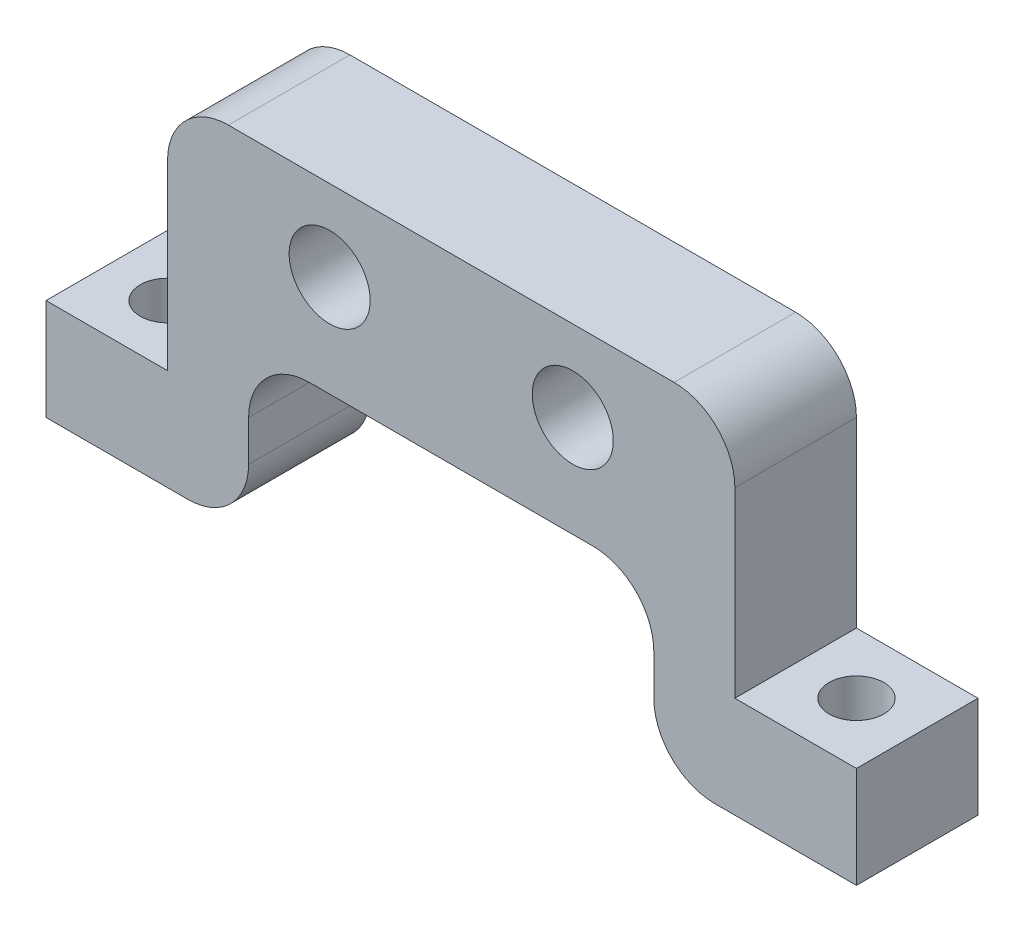
ISO-10303-21;
HEADER;
FILE_DESCRIPTION(('STEP AP214'),'2;1');
FILE_NAME('part.step','',(''),(''),'','','');
FILE_SCHEMA(('AUTOMOTIVE_DESIGN { 1 0 10303 214 1 1 1 1 }'));
ENDSEC;
DATA;
#1=APPLICATION_CONTEXT('core data for automotive mechanical design processes');
#2=APPLICATION_PROTOCOL_DEFINITION('international standard','automotive_design',2000,#1);
#3=PRODUCT_CONTEXT('',#1,'mechanical');
#4=PRODUCT('Part','Part','',(#3));
#5=PRODUCT_RELATED_PRODUCT_CATEGORY('part','',(#4));
#6=PRODUCT_DEFINITION_FORMATION('','',#4);
#7=PRODUCT_DEFINITION_CONTEXT('part definition',#1,'design');
#8=PRODUCT_DEFINITION('design','',#6,#7);
#9=PRODUCT_DEFINITION_SHAPE('','',#8);
#10=(LENGTH_UNIT() NAMED_UNIT(*) SI_UNIT(.MILLI.,.METRE.));
#11=(NAMED_UNIT(*) PLANE_ANGLE_UNIT() SI_UNIT($,.RADIAN.));
#12=(NAMED_UNIT(*) SI_UNIT($,.STERADIAN.) SOLID_ANGLE_UNIT());
#13=UNCERTAINTY_MEASURE_WITH_UNIT(LENGTH_MEASURE(1.E-05),#10,'distance_accuracy_value','');
#14=(GEOMETRIC_REPRESENTATION_CONTEXT(3) GLOBAL_UNCERTAINTY_ASSIGNED_CONTEXT((#13)) GLOBAL_UNIT_ASSIGNED_CONTEXT((#10,
#11,#12)) REPRESENTATION_CONTEXT('',''));
#15=CARTESIAN_POINT('',(0.,0.,0.));
#16=DIRECTION('',(0.,0.,1.));
#17=DIRECTION('',(1.,0.,0.));
#18=AXIS2_PLACEMENT_3D('',#15,#16,#17);
#19=CARTESIAN_POINT('',(-9.,-8.5,6.));
#20=DIRECTION('',(0.,1.,0.));
#21=DIRECTION('',(0.,0.,1.));
#22=AXIS2_PLACEMENT_3D('',#19,#20,#21);
#23=PLANE('',#22);
#24=CARTESIAN_POINT('',(-17.,-8.49999999999999,3.00000000000001));
#25=DIRECTION('',(0.,1.,0.));
#26=DIRECTION('',(1.,0.,0.));
#27=AXIS2_PLACEMENT_3D('',#24,#25,#26);
#28=CIRCLE('',#27,1.35);
#29=CARTESIAN_POINT('',(-15.65,-8.49999999999999,3.00000000000001));
#30=VERTEX_POINT('',#29);
#31=EDGE_CURVE('E379',#30,#30,#28,.T.);
#32=ORIENTED_EDGE('',*,*,#31,.T.);
#33=EDGE_LOOP('',(#32));
#34=FACE_BOUND('',#33,.T.);
#35=DIRECTION('',(1.,0.,0.));
#36=VECTOR('',#35,1.);
#37=CARTESIAN_POINT('',(-9.,-8.5,0.));
#38=LINE('',#37,#36);
#39=CARTESIAN_POINT('',(-20.,-8.5,0.));
#40=VERTEX_POINT('',#39);
#41=CARTESIAN_POINT('',(-13.,-8.5,0.));
#42=VERTEX_POINT('',#41);
#43=EDGE_CURVE('E235',#40,#42,#38,.T.);
#44=ORIENTED_EDGE('',*,*,#43,.T.);
#45=DIRECTION('',(0.,0.,1.));
#46=VECTOR('',#45,1.);
#47=CARTESIAN_POINT('',(-13.,-8.5,6.));
#48=LINE('',#47,#46);
#49=CARTESIAN_POINT('',(-13.,-8.5,6.));
#50=VERTEX_POINT('',#49);
#51=EDGE_CURVE('E168',#42,#50,#48,.T.);
#52=ORIENTED_EDGE('',*,*,#51,.T.);
#53=DIRECTION('',(1.,0.,0.));
#54=VECTOR('',#53,1.);
#55=CARTESIAN_POINT('',(-9.,-8.5,6.));
#56=LINE('',#55,#54);
#57=CARTESIAN_POINT('',(-20.,-8.5,6.));
#58=VERTEX_POINT('',#57);
#59=EDGE_CURVE('E162',#58,#50,#56,.T.);
#60=ORIENTED_EDGE('',*,*,#59,.F.);
#61=DIRECTION('',(0.,0.,-1.));
#62=VECTOR('',#61,1.);
#63=CARTESIAN_POINT('',(-20.,-8.5,6.));
#64=LINE('',#63,#62);
#65=EDGE_CURVE('E165',#58,#40,#64,.T.);
#66=ORIENTED_EDGE('',*,*,#65,.T.);
#67=EDGE_LOOP('',(#44,#52,#60,#66));
#68=FACE_BOUND('',#67,.T.);
#69=ADVANCED_FACE('F35',(#34,#68),#23,.F.);
#70=CARTESIAN_POINT('',(-9.,8.5,6.));
#71=DIRECTION('',(0.,-1.,0.));
#72=DIRECTION('',(0.,0.,-1.));
#73=AXIS2_PLACEMENT_3D('',#70,#71,#72);
#74=PLANE('',#73);
#75=DIRECTION('',(-1.,0.,0.));
#76=VECTOR('',#75,1.);
#77=CARTESIAN_POINT('',(-9.,8.5,0.));
#78=LINE('',#77,#76);
#79=CARTESIAN_POINT('',(11.,8.5,0.));
#80=VERTEX_POINT('',#79);
#81=CARTESIAN_POINT('',(-11.,8.5,0.));
#82=VERTEX_POINT('',#81);
#83=EDGE_CURVE('E228',#80,#82,#78,.T.);
#84=ORIENTED_EDGE('',*,*,#83,.T.);
#85=DIRECTION('',(0.,0.,-1.));
#86=VECTOR('',#85,1.);
#87=CARTESIAN_POINT('',(-11.,8.5,6.));
#88=LINE('',#87,#86);
#89=CARTESIAN_POINT('',(-11.,8.5,6.));
#90=VERTEX_POINT('',#89);
#91=EDGE_CURVE('E296',#82,#90,#88,.F.);
#92=ORIENTED_EDGE('',*,*,#91,.T.);
#93=DIRECTION('',(-1.,0.,0.));
#94=VECTOR('',#93,1.);
#95=CARTESIAN_POINT('',(-9.,8.5,6.));
#96=LINE('',#95,#94);
#97=CARTESIAN_POINT('',(11.,8.5,6.));
#98=VERTEX_POINT('',#97);
#99=EDGE_CURVE('E233',#98,#90,#96,.T.);
#100=ORIENTED_EDGE('',*,*,#99,.F.);
#101=DIRECTION('',(0.,0.,-1.));
#102=VECTOR('',#101,1.);
#103=CARTESIAN_POINT('',(11.,8.5,0.));
#104=LINE('',#103,#102);
#105=EDGE_CURVE('E293',#98,#80,#104,.T.);
#106=ORIENTED_EDGE('',*,*,#105,.T.);
#107=EDGE_LOOP('',(#84,#92,#100,#106));
#108=FACE_BOUND('',#107,.T.);
#109=ADVANCED_FACE('F338',(#108),#74,.F.);
#110=CARTESIAN_POINT('',(17.,-8.50000000000001,3.));
#111=DIRECTION('',(0.,1.,0.));
#112=DIRECTION('',(-1.,0.,0.));
#113=AXIS2_PLACEMENT_3D('',#110,#111,#112);
#114=CIRCLE('',#113,1.35);
#115=CARTESIAN_POINT('',(15.65,-8.50000000000001,3.));
#116=VERTEX_POINT('',#115);
#117=EDGE_CURVE('E202',#116,#116,#114,.T.);
#118=ORIENTED_EDGE('',*,*,#117,.T.);
#119=EDGE_LOOP('',(#118));
#120=FACE_BOUND('',#119,.T.);
#121=CARTESIAN_POINT('',(13.,-8.5,6.));
#122=VERTEX_POINT('',#121);
#123=CARTESIAN_POINT('',(20.,-8.5,6.));
#124=VERTEX_POINT('',#123);
#125=EDGE_CURVE('E172',#122,#124,#56,.T.);
#126=ORIENTED_EDGE('',*,*,#125,.F.);
#127=DIRECTION('',(0.,0.,1.));
#128=VECTOR('',#127,1.);
#129=CARTESIAN_POINT('',(13.,-8.5,6.));
#130=LINE('',#129,#128);
#131=CARTESIAN_POINT('',(13.,-8.5,0.));
#132=VERTEX_POINT('',#131);
#133=EDGE_CURVE('E270',#122,#132,#130,.F.);
#134=ORIENTED_EDGE('',*,*,#133,.T.);
#135=CARTESIAN_POINT('',(20.,-8.5,0.));
#136=VERTEX_POINT('',#135);
#137=EDGE_CURVE('E239',#132,#136,#38,.T.);
#138=ORIENTED_EDGE('',*,*,#137,.T.);
#139=DIRECTION('',(0.,0.,-1.));
#140=VECTOR('',#139,1.);
#141=CARTESIAN_POINT('',(20.,-8.5,6.));
#142=LINE('',#141,#140);
#143=EDGE_CURVE('E225',#124,#136,#142,.T.);
#144=ORIENTED_EDGE('',*,*,#143,.F.);
#145=EDGE_LOOP('',(#126,#134,#138,#144));
#146=FACE_BOUND('',#145,.T.);
#147=ADVANCED_FACE('F361',(#120,#146),#23,.F.);
#148=CARTESIAN_POINT('',(0.,0.,6.));
#149=DIRECTION('',(0.,0.,-1.));
#150=DIRECTION('',(-1.,0.,0.));
#151=AXIS2_PLACEMENT_3D('',#148,#149,#150);
#152=PLANE('',#151);
#153=CARTESIAN_POINT('',(6.,4.5,6.));
#154=DIRECTION('',(0.,0.,1.));
#155=DIRECTION('',(-1.,0.,0.));
#156=AXIS2_PLACEMENT_3D('',#153,#154,#155);
#157=CIRCLE('',#156,2.);
#158=CARTESIAN_POINT('',(4.,4.5,6.));
#159=VERTEX_POINT('',#158);
#160=EDGE_CURVE('E249',#159,#159,#157,.T.);
#161=ORIENTED_EDGE('',*,*,#160,.F.);
#162=EDGE_LOOP('',(#161));
#163=FACE_BOUND('',#162,.T.);
#164=CARTESIAN_POINT('',(-6.,4.5,6.));
#165=DIRECTION('',(0.,0.,1.));
#166=DIRECTION('',(1.,0.,0.));
#167=AXIS2_PLACEMENT_3D('',#164,#165,#166);
#168=CIRCLE('',#167,2.);
#169=CARTESIAN_POINT('',(-4.,4.5,6.));
#170=VERTEX_POINT('',#169);
#171=EDGE_CURVE('E245',#170,#170,#168,.T.);
#172=ORIENTED_EDGE('',*,*,#171,.F.);
#173=EDGE_LOOP('',(#172));
#174=FACE_BOUND('',#173,.T.);
#175=DIRECTION('',(0.,1.,0.));
#176=VECTOR('',#175,1.);
#177=CARTESIAN_POINT('',(10.,-8.49999999999999,6.));
#178=LINE('',#177,#176);
#179=CARTESIAN_POINT('',(10.,-5.5,6.));
#180=VERTEX_POINT('',#179);
#181=CARTESIAN_POINT('',(10.,-3.5,6.));
#182=VERTEX_POINT('',#181);
#183=EDGE_CURVE('E311',#180,#182,#178,.T.);
#184=ORIENTED_EDGE('',*,*,#183,.F.);
#185=CARTESIAN_POINT('',(13.,-5.5,6.));
#186=DIRECTION('',(0.,0.,-1.));
#187=DIRECTION('',(-1.,0.,0.));
#188=AXIS2_PLACEMENT_3D('',#185,#186,#187);
#189=CIRCLE('',#188,3.);
#190=EDGE_CURVE('E268',#180,#122,#189,.F.);
#191=ORIENTED_EDGE('',*,*,#190,.T.);
#192=ORIENTED_EDGE('',*,*,#125,.T.);
#193=DIRECTION('',(0.,-1.,0.));
#194=VECTOR('',#193,1.);
#195=CARTESIAN_POINT('',(20.,-8.5,6.));
#196=LINE('',#195,#194);
#197=CARTESIAN_POINT('',(20.,-3.5,6.));
#198=VERTEX_POINT('',#197);
#199=EDGE_CURVE('E215',#198,#124,#196,.T.);
#200=ORIENTED_EDGE('',*,*,#199,.F.);
#201=DIRECTION('',(1.,0.,0.));
#202=VECTOR('',#201,1.);
#203=CARTESIAN_POINT('',(14.,-3.5,6.));
#204=LINE('',#203,#202);
#205=CARTESIAN_POINT('',(14.,-3.5,6.));
#206=VERTEX_POINT('',#205);
#207=EDGE_CURVE('E211',#206,#198,#204,.T.);
#208=ORIENTED_EDGE('',*,*,#207,.F.);
#209=DIRECTION('',(0.,-1.,0.));
#210=VECTOR('',#209,1.);
#211=CARTESIAN_POINT('',(14.,8.5,6.));
#212=LINE('',#211,#210);
#213=CARTESIAN_POINT('',(14.,5.5,6.));
#214=VERTEX_POINT('',#213);
#215=EDGE_CURVE('E209',#214,#206,#212,.T.);
#216=ORIENTED_EDGE('',*,*,#215,.F.);
#217=CARTESIAN_POINT('',(11.,5.5,6.));
#218=DIRECTION('',(0.,0.,-1.));
#219=DIRECTION('',(-1.,0.,0.));
#220=AXIS2_PLACEMENT_3D('',#217,#218,#219);
#221=CIRCLE('',#220,3.);
#222=EDGE_CURVE('E262',#214,#98,#221,.F.);
#223=ORIENTED_EDGE('',*,*,#222,.T.);
#224=ORIENTED_EDGE('',*,*,#99,.T.);
#225=CARTESIAN_POINT('',(-11.,5.5,6.));
#226=DIRECTION('',(0.,0.,-1.));
#227=DIRECTION('',(-1.,0.,0.));
#228=AXIS2_PLACEMENT_3D('',#225,#226,#227);
#229=CIRCLE('',#228,3.);
#230=CARTESIAN_POINT('',(-14.,5.5,6.));
#231=VERTEX_POINT('',#230);
#232=EDGE_CURVE('E264',#90,#231,#229,.F.);
#233=ORIENTED_EDGE('',*,*,#232,.T.);
#234=DIRECTION('',(0.,1.,0.));
#235=VECTOR('',#234,1.);
#236=CARTESIAN_POINT('',(-14.,8.5,6.));
#237=LINE('',#236,#235);
#238=CARTESIAN_POINT('',(-14.,-3.5,6.));
#239=VERTEX_POINT('',#238);
#240=EDGE_CURVE('E181',#239,#231,#237,.T.);
#241=ORIENTED_EDGE('',*,*,#240,.F.);
#242=DIRECTION('',(1.,0.,0.));
#243=VECTOR('',#242,1.);
#244=CARTESIAN_POINT('',(-14.,-3.5,6.));
#245=LINE('',#244,#243);
#246=CARTESIAN_POINT('',(-20.,-3.5,6.));
#247=VERTEX_POINT('',#246);
#248=EDGE_CURVE('E188',#247,#239,#245,.T.);
#249=ORIENTED_EDGE('',*,*,#248,.F.);
#250=DIRECTION('',(0.,1.,0.));
#251=VECTOR('',#250,1.);
#252=CARTESIAN_POINT('',(-20.,-8.5,6.));
#253=LINE('',#252,#251);
#254=EDGE_CURVE('E177',#58,#247,#253,.T.);
#255=ORIENTED_EDGE('',*,*,#254,.F.);
#256=ORIENTED_EDGE('',*,*,#59,.T.);
#257=CARTESIAN_POINT('',(-13.,-5.5,6.));
#258=DIRECTION('',(0.,0.,-1.));
#259=DIRECTION('',(-1.,0.,0.));
#260=AXIS2_PLACEMENT_3D('',#257,#258,#259);
#261=CIRCLE('',#260,3.);
#262=CARTESIAN_POINT('',(-10.,-5.5,6.));
#263=VERTEX_POINT('',#262);
#264=EDGE_CURVE('E266',#50,#263,#261,.F.);
#265=ORIENTED_EDGE('',*,*,#264,.T.);
#266=DIRECTION('',(0.,-1.,0.));
#267=VECTOR('',#266,1.);
#268=CARTESIAN_POINT('',(-10.,-8.49999999999999,6.));
#269=LINE('',#268,#267);
#270=CARTESIAN_POINT('',(-10.,-3.5,6.));
#271=VERTEX_POINT('',#270);
#272=EDGE_CURVE('E306',#271,#263,#269,.T.);
#273=ORIENTED_EDGE('',*,*,#272,.F.);
#274=CARTESIAN_POINT('',(-7.,-3.5,6.));
#275=DIRECTION('',(0.,0.,-1.));
#276=DIRECTION('',(-1.,0.,0.));
#277=AXIS2_PLACEMENT_3D('',#274,#275,#276);
#278=CIRCLE('',#277,3.);
#279=CARTESIAN_POINT('',(-7.,-0.499999999999995,6.));
#280=VERTEX_POINT('',#279);
#281=EDGE_CURVE('E43',#271,#280,#278,.T.);
#282=ORIENTED_EDGE('',*,*,#281,.T.);
#283=DIRECTION('',(-1.,0.,0.));
#284=VECTOR('',#283,1.);
#285=CARTESIAN_POINT('',(-10.,-0.499999999999995,6.));
#286=LINE('',#285,#284);
#287=CARTESIAN_POINT('',(7.,-0.499999999999995,6.));
#288=VERTEX_POINT('',#287);
#289=EDGE_CURVE('E304',#288,#280,#286,.T.);
#290=ORIENTED_EDGE('',*,*,#289,.F.);
#291=CARTESIAN_POINT('',(7.,-3.5,6.));
#292=DIRECTION('',(0.,0.,-1.));
#293=DIRECTION('',(-1.,0.,0.));
#294=AXIS2_PLACEMENT_3D('',#291,#292,#293);
#295=CIRCLE('',#294,3.);
#296=EDGE_CURVE('E300',#288,#182,#295,.T.);
#297=ORIENTED_EDGE('',*,*,#296,.T.);
#298=EDGE_LOOP('',(#184,#191,#192,#200,#208,#216,#223,#224,#233,#241,#249,#255,#256,#265,#273,
#282,#290,#297));
#299=FACE_BOUND('',#298,.T.);
#300=ADVANCED_FACE('F185',(#163,#174,#299),#152,.F.);
#301=CARTESIAN_POINT('',(0.,0.,0.));
#302=DIRECTION('',(0.,0.,-1.));
#303=DIRECTION('',(-1.,0.,0.));
#304=AXIS2_PLACEMENT_3D('',#301,#302,#303);
#305=PLANE('',#304);
#306=ORIENTED_EDGE('',*,*,#137,.F.);
#307=CARTESIAN_POINT('',(13.,-5.5,0.));
#308=DIRECTION('',(0.,0.,-1.));
#309=DIRECTION('',(-1.,0.,0.));
#310=AXIS2_PLACEMENT_3D('',#307,#308,#309);
#311=CIRCLE('',#310,3.);
#312=CARTESIAN_POINT('',(10.,-5.5,0.));
#313=VERTEX_POINT('',#312);
#314=EDGE_CURVE('E278',#132,#313,#311,.T.);
#315=ORIENTED_EDGE('',*,*,#314,.T.);
#316=DIRECTION('',(0.,-1.,0.));
#317=VECTOR('',#316,1.);
#318=CARTESIAN_POINT('',(10.,0.,0.));
#319=LINE('',#318,#317);
#320=CARTESIAN_POINT('',(10.,-3.5,0.));
#321=VERTEX_POINT('',#320);
#322=EDGE_CURVE('E171',#321,#313,#319,.T.);
#323=ORIENTED_EDGE('',*,*,#322,.F.);
#324=CARTESIAN_POINT('',(7.,-3.5,0.));
#325=DIRECTION('',(0.,0.,-1.));
#326=DIRECTION('',(-1.,0.,0.));
#327=AXIS2_PLACEMENT_3D('',#324,#325,#326);
#328=CIRCLE('',#327,3.);
#329=CARTESIAN_POINT('',(7.,-0.499999999999995,0.));
#330=VERTEX_POINT('',#329);
#331=EDGE_CURVE('E50',#321,#330,#328,.F.);
#332=ORIENTED_EDGE('',*,*,#331,.T.);
#333=DIRECTION('',(1.,0.,0.));
#334=VECTOR('',#333,1.);
#335=CARTESIAN_POINT('',(0.,-0.499999999999995,0.));
#336=LINE('',#335,#334);
#337=CARTESIAN_POINT('',(-7.,-0.499999999999995,0.));
#338=VERTEX_POINT('',#337);
#339=EDGE_CURVE('E252',#338,#330,#336,.T.);
#340=ORIENTED_EDGE('',*,*,#339,.F.);
#341=CARTESIAN_POINT('',(-7.,-3.5,0.));
#342=DIRECTION('',(0.,0.,-1.));
#343=DIRECTION('',(-1.,0.,0.));
#344=AXIS2_PLACEMENT_3D('',#341,#342,#343);
#345=CIRCLE('',#344,3.);
#346=CARTESIAN_POINT('',(-10.,-3.5,0.));
#347=VERTEX_POINT('',#346);
#348=EDGE_CURVE('E11',#338,#347,#345,.F.);
#349=ORIENTED_EDGE('',*,*,#348,.T.);
#350=DIRECTION('',(0.,1.,0.));
#351=VECTOR('',#350,1.);
#352=CARTESIAN_POINT('',(-10.,0.,0.));
#353=LINE('',#352,#351);
#354=CARTESIAN_POINT('',(-10.,-5.5,0.));
#355=VERTEX_POINT('',#354);
#356=EDGE_CURVE('E254',#355,#347,#353,.T.);
#357=ORIENTED_EDGE('',*,*,#356,.F.);
#358=CARTESIAN_POINT('',(-13.,-5.5,0.));
#359=DIRECTION('',(0.,0.,-1.));
#360=DIRECTION('',(-1.,0.,0.));
#361=AXIS2_PLACEMENT_3D('',#358,#359,#360);
#362=CIRCLE('',#361,3.);
#363=EDGE_CURVE('E276',#355,#42,#362,.T.);
#364=ORIENTED_EDGE('',*,*,#363,.T.);
#365=ORIENTED_EDGE('',*,*,#43,.F.);
#366=DIRECTION('',(0.,1.,0.));
#367=VECTOR('',#366,1.);
#368=CARTESIAN_POINT('',(-20.,-8.5,0.));
#369=LINE('',#368,#367);
#370=CARTESIAN_POINT('',(-20.,-3.5,0.));
#371=VERTEX_POINT('',#370);
#372=EDGE_CURVE('E179',#40,#371,#369,.T.);
#373=ORIENTED_EDGE('',*,*,#372,.T.);
#374=DIRECTION('',(1.,0.,0.));
#375=VECTOR('',#374,1.);
#376=CARTESIAN_POINT('',(-14.,-3.5,0.));
#377=LINE('',#376,#375);
#378=CARTESIAN_POINT('',(-14.,-3.5,0.));
#379=VERTEX_POINT('',#378);
#380=EDGE_CURVE('E193',#371,#379,#377,.T.);
#381=ORIENTED_EDGE('',*,*,#380,.T.);
#382=DIRECTION('',(0.,1.,0.));
#383=VECTOR('',#382,1.);
#384=CARTESIAN_POINT('',(-14.,8.5,0.));
#385=LINE('',#384,#383);
#386=CARTESIAN_POINT('',(-14.,5.5,0.));
#387=VERTEX_POINT('',#386);
#388=EDGE_CURVE('E189',#379,#387,#385,.T.);
#389=ORIENTED_EDGE('',*,*,#388,.T.);
#390=CARTESIAN_POINT('',(-11.,5.5,0.));
#391=DIRECTION('',(0.,0.,-1.));
#392=DIRECTION('',(-1.,0.,0.));
#393=AXIS2_PLACEMENT_3D('',#390,#391,#392);
#394=CIRCLE('',#393,3.);
#395=EDGE_CURVE('E274',#387,#82,#394,.T.);
#396=ORIENTED_EDGE('',*,*,#395,.T.);
#397=ORIENTED_EDGE('',*,*,#83,.F.);
#398=CARTESIAN_POINT('',(11.,5.5,0.));
#399=DIRECTION('',(0.,0.,-1.));
#400=DIRECTION('',(-1.,0.,0.));
#401=AXIS2_PLACEMENT_3D('',#398,#399,#400);
#402=CIRCLE('',#401,3.);
#403=CARTESIAN_POINT('',(14.,5.5,0.));
#404=VERTEX_POINT('',#403);
#405=EDGE_CURVE('E272',#80,#404,#402,.T.);
#406=ORIENTED_EDGE('',*,*,#405,.T.);
#407=DIRECTION('',(0.,-1.,0.));
#408=VECTOR('',#407,1.);
#409=CARTESIAN_POINT('',(14.,8.5,0.));
#410=LINE('',#409,#408);
#411=CARTESIAN_POINT('',(14.,-3.5,0.));
#412=VERTEX_POINT('',#411);
#413=EDGE_CURVE('E207',#404,#412,#410,.T.);
#414=ORIENTED_EDGE('',*,*,#413,.T.);
#415=DIRECTION('',(1.,0.,0.));
#416=VECTOR('',#415,1.);
#417=CARTESIAN_POINT('',(14.,-3.5,0.));
#418=LINE('',#417,#416);
#419=CARTESIAN_POINT('',(20.,-3.5,0.));
#420=VERTEX_POINT('',#419);
#421=EDGE_CURVE('E220',#412,#420,#418,.T.);
#422=ORIENTED_EDGE('',*,*,#421,.T.);
#423=DIRECTION('',(0.,-1.,0.));
#424=VECTOR('',#423,1.);
#425=CARTESIAN_POINT('',(20.,-8.5,0.));
#426=LINE('',#425,#424);
#427=EDGE_CURVE('E212',#420,#136,#426,.T.);
#428=ORIENTED_EDGE('',*,*,#427,.T.);
#429=EDGE_LOOP('',(#306,#315,#323,#332,#340,#349,#357,#364,#365,#373,#381,#389,#396,#397,#406,
#414,#422,#428));
#430=FACE_BOUND('',#429,.T.);
#431=CARTESIAN_POINT('',(6.,4.5,0.));
#432=DIRECTION('',(0.,0.,-1.));
#433=DIRECTION('',(-1.,0.,0.));
#434=AXIS2_PLACEMENT_3D('',#431,#432,#433);
#435=CIRCLE('',#434,2.);
#436=CARTESIAN_POINT('',(4.,4.5,0.));
#437=VERTEX_POINT('',#436);
#438=EDGE_CURVE('E246',#437,#437,#435,.T.);
#439=ORIENTED_EDGE('',*,*,#438,.F.);
#440=EDGE_LOOP('',(#439));
#441=FACE_BOUND('',#440,.T.);
#442=CARTESIAN_POINT('',(-6.,4.5,0.));
#443=DIRECTION('',(0.,0.,-1.));
#444=DIRECTION('',(-1.,0.,0.));
#445=AXIS2_PLACEMENT_3D('',#442,#443,#444);
#446=CIRCLE('',#445,2.);
#447=CARTESIAN_POINT('',(-8.,4.5,0.));
#448=VERTEX_POINT('',#447);
#449=EDGE_CURVE('E241',#448,#448,#446,.T.);
#450=ORIENTED_EDGE('',*,*,#449,.F.);
#451=EDGE_LOOP('',(#450));
#452=FACE_BOUND('',#451,.T.);
#453=ADVANCED_FACE('F317',(#430,#441,#452),#305,.T.);
#454=CARTESIAN_POINT('',(20.,-8.5,6.));
#455=DIRECTION('',(1.,0.,0.));
#456=DIRECTION('',(0.,0.,-1.));
#457=AXIS2_PLACEMENT_3D('',#454,#455,#456);
#458=PLANE('',#457);
#459=ORIENTED_EDGE('',*,*,#427,.F.);
#460=DIRECTION('',(0.,0.,-1.));
#461=VECTOR('',#460,1.);
#462=CARTESIAN_POINT('',(20.,-3.5,6.));
#463=LINE('',#462,#461);
#464=EDGE_CURVE('E229',#198,#420,#463,.T.);
#465=ORIENTED_EDGE('',*,*,#464,.F.);
#466=ORIENTED_EDGE('',*,*,#199,.T.);
#467=ORIENTED_EDGE('',*,*,#143,.T.);
#468=EDGE_LOOP('',(#459,#465,#466,#467));
#469=FACE_BOUND('',#468,.T.);
#470=ADVANCED_FACE('F356',(#469),#458,.T.);
#471=CARTESIAN_POINT('',(14.,-3.5,6.));
#472=DIRECTION('',(0.,1.,0.));
#473=DIRECTION('',(-1.,0.,0.));
#474=AXIS2_PLACEMENT_3D('',#471,#472,#473);
#475=PLANE('',#474);
#476=CARTESIAN_POINT('',(17.,-3.50000000000001,3.));
#477=DIRECTION('',(0.,1.,0.));
#478=DIRECTION('',(-1.,0.,0.));
#479=AXIS2_PLACEMENT_3D('',#476,#477,#478);
#480=CIRCLE('',#479,1.35);
#481=CARTESIAN_POINT('',(15.65,-3.50000000000001,3.));
#482=VERTEX_POINT('',#481);
#483=EDGE_CURVE('E196',#482,#482,#480,.T.);
#484=ORIENTED_EDGE('',*,*,#483,.F.);
#485=EDGE_LOOP('',(#484));
#486=FACE_BOUND('',#485,.T.);
#487=ORIENTED_EDGE('',*,*,#421,.F.);
#488=DIRECTION('',(0.,0.,-1.));
#489=VECTOR('',#488,1.);
#490=CARTESIAN_POINT('',(14.,-3.5,6.));
#491=LINE('',#490,#489);
#492=EDGE_CURVE('E218',#206,#412,#491,.T.);
#493=ORIENTED_EDGE('',*,*,#492,.F.);
#494=ORIENTED_EDGE('',*,*,#207,.T.);
#495=ORIENTED_EDGE('',*,*,#464,.T.);
#496=EDGE_LOOP('',(#487,#493,#494,#495));
#497=FACE_BOUND('',#496,.T.);
#498=ADVANCED_FACE('F352',(#486,#497),#475,.T.);
#499=CARTESIAN_POINT('',(14.,8.5,6.));
#500=DIRECTION('',(1.,0.,0.));
#501=DIRECTION('',(0.,1.,0.));
#502=AXIS2_PLACEMENT_3D('',#499,#500,#501);
#503=PLANE('',#502);
#504=ORIENTED_EDGE('',*,*,#413,.F.);
#505=DIRECTION('',(0.,0.,-1.));
#506=VECTOR('',#505,1.);
#507=CARTESIAN_POINT('',(14.,5.5,6.));
#508=LINE('',#507,#506);
#509=EDGE_CURVE('E298',#404,#214,#508,.F.);
#510=ORIENTED_EDGE('',*,*,#509,.T.);
#511=ORIENTED_EDGE('',*,*,#215,.T.);
#512=ORIENTED_EDGE('',*,*,#492,.T.);
#513=EDGE_LOOP('',(#504,#510,#511,#512));
#514=FACE_BOUND('',#513,.T.);
#515=ADVANCED_FACE('F346',(#514),#503,.T.);
#516=CARTESIAN_POINT('',(-14.,8.5,6.));
#517=DIRECTION('',(-1.,0.,0.));
#518=DIRECTION('',(0.,-1.,0.));
#519=AXIS2_PLACEMENT_3D('',#516,#517,#518);
#520=PLANE('',#519);
#521=ORIENTED_EDGE('',*,*,#240,.T.);
#522=DIRECTION('',(0.,0.,-1.));
#523=VECTOR('',#522,1.);
#524=CARTESIAN_POINT('',(-14.,5.5,0.));
#525=LINE('',#524,#523);
#526=EDGE_CURVE('E290',#231,#387,#525,.T.);
#527=ORIENTED_EDGE('',*,*,#526,.T.);
#528=ORIENTED_EDGE('',*,*,#388,.F.);
#529=DIRECTION('',(0.,0.,-1.));
#530=VECTOR('',#529,1.);
#531=CARTESIAN_POINT('',(-14.,-3.5,6.));
#532=LINE('',#531,#530);
#533=EDGE_CURVE('E205',#239,#379,#532,.T.);
#534=ORIENTED_EDGE('',*,*,#533,.F.);
#535=EDGE_LOOP('',(#521,#527,#528,#534));
#536=FACE_BOUND('',#535,.T.);
#537=ADVANCED_FACE('F330',(#536),#520,.T.);
#538=CARTESIAN_POINT('',(-14.,-3.5,6.));
#539=DIRECTION('',(0.,1.,0.));
#540=DIRECTION('',(-1.,0.,0.));
#541=AXIS2_PLACEMENT_3D('',#538,#539,#540);
#542=PLANE('',#541);
#543=CARTESIAN_POINT('',(-17.,-3.49999999999999,3.00000000000001));
#544=DIRECTION('',(0.,1.,0.));
#545=DIRECTION('',(1.,0.,0.));
#546=AXIS2_PLACEMENT_3D('',#543,#544,#545);
#547=CIRCLE('',#546,1.35);
#548=CARTESIAN_POINT('',(-15.65,-3.49999999999999,3.00000000000001));
#549=VERTEX_POINT('',#548);
#550=EDGE_CURVE('E244',#549,#549,#547,.T.);
#551=ORIENTED_EDGE('',*,*,#550,.F.);
#552=EDGE_LOOP('',(#551));
#553=FACE_BOUND('',#552,.T.);
#554=ORIENTED_EDGE('',*,*,#380,.F.);
#555=DIRECTION('',(0.,0.,-1.));
#556=VECTOR('',#555,1.);
#557=CARTESIAN_POINT('',(-20.,-3.5,6.));
#558=LINE('',#557,#556);
#559=EDGE_CURVE('E180',#247,#371,#558,.T.);
#560=ORIENTED_EDGE('',*,*,#559,.F.);
#561=ORIENTED_EDGE('',*,*,#248,.T.);
#562=ORIENTED_EDGE('',*,*,#533,.T.);
#563=EDGE_LOOP('',(#554,#560,#561,#562));
#564=FACE_BOUND('',#563,.T.);
#565=ADVANCED_FACE('F328',(#553,#564),#542,.T.);
#566=CARTESIAN_POINT('',(-20.,-8.5,6.));
#567=DIRECTION('',(-1.,0.,0.));
#568=DIRECTION('',(0.,0.,1.));
#569=AXIS2_PLACEMENT_3D('',#566,#567,#568);
#570=PLANE('',#569);
#571=ORIENTED_EDGE('',*,*,#372,.F.);
#572=ORIENTED_EDGE('',*,*,#65,.F.);
#573=ORIENTED_EDGE('',*,*,#254,.T.);
#574=ORIENTED_EDGE('',*,*,#559,.T.);
#575=EDGE_LOOP('',(#571,#572,#573,#574));
#576=FACE_BOUND('',#575,.T.);
#577=ADVANCED_FACE('F176',(#576),#570,.T.);
#578=CARTESIAN_POINT('',(17.,-8.50000000000001,3.));
#579=DIRECTION('',(0.,1.,0.));
#580=DIRECTION('',(-1.,0.,0.));
#581=AXIS2_PLACEMENT_3D('',#578,#579,#580);
#582=CYLINDRICAL_SURFACE('',#581,1.35);
#583=ORIENTED_EDGE('',*,*,#117,.F.);
#584=EDGE_LOOP('',(#583));
#585=FACE_BOUND('',#584,.T.);
#586=ORIENTED_EDGE('',*,*,#483,.T.);
#587=EDGE_LOOP('',(#586));
#588=FACE_BOUND('',#587,.T.);
#589=ADVANCED_FACE('F389',(#585,#588),#582,.F.);
#590=CARTESIAN_POINT('',(-17.,-8.49999999999999,3.00000000000001));
#591=DIRECTION('',(0.,1.,0.));
#592=DIRECTION('',(-1.,0.,0.));
#593=AXIS2_PLACEMENT_3D('',#590,#591,#592);
#594=CYLINDRICAL_SURFACE('',#593,1.35);
#595=ORIENTED_EDGE('',*,*,#31,.F.);
#596=EDGE_LOOP('',(#595));
#597=FACE_BOUND('',#596,.T.);
#598=ORIENTED_EDGE('',*,*,#550,.T.);
#599=EDGE_LOOP('',(#598));
#600=FACE_BOUND('',#599,.T.);
#601=ADVANCED_FACE('F423',(#597,#600),#594,.F.);
#602=CARTESIAN_POINT('',(-6.,4.5,-4.));
#603=DIRECTION('',(0.,0.,1.));
#604=DIRECTION('',(1.,0.,0.));
#605=AXIS2_PLACEMENT_3D('',#602,#603,#604);
#606=CYLINDRICAL_SURFACE('',#605,2.);
#607=ORIENTED_EDGE('',*,*,#449,.T.);
#608=EDGE_LOOP('',(#607));
#609=FACE_BOUND('',#608,.T.);
#610=ORIENTED_EDGE('',*,*,#171,.T.);
#611=EDGE_LOOP('',(#610));
#612=FACE_BOUND('',#611,.T.);
#613=ADVANCED_FACE('F420',(#609,#612),#606,.F.);
#614=CARTESIAN_POINT('',(6.,4.5,-4.));
#615=DIRECTION('',(0.,0.,1.));
#616=DIRECTION('',(1.,0.,0.));
#617=AXIS2_PLACEMENT_3D('',#614,#615,#616);
#618=CYLINDRICAL_SURFACE('',#617,2.);
#619=ORIENTED_EDGE('',*,*,#438,.T.);
#620=EDGE_LOOP('',(#619));
#621=FACE_BOUND('',#620,.T.);
#622=ORIENTED_EDGE('',*,*,#160,.T.);
#623=EDGE_LOOP('',(#622));
#624=FACE_BOUND('',#623,.T.);
#625=ADVANCED_FACE('F422',(#621,#624),#618,.F.);
#626=CARTESIAN_POINT('',(-10.,-8.49999999999999,-4.));
#627=DIRECTION('',(-1.,0.,0.));
#628=DIRECTION('',(0.,0.,1.));
#629=AXIS2_PLACEMENT_3D('',#626,#627,#628);
#630=PLANE('',#629);
#631=ORIENTED_EDGE('',*,*,#356,.T.);
#632=DIRECTION('',(0.,0.,1.));
#633=VECTOR('',#632,1.);
#634=CARTESIAN_POINT('',(-10.,-3.5,6.));
#635=LINE('',#634,#633);
#636=EDGE_CURVE('E286',#347,#271,#635,.T.);
#637=ORIENTED_EDGE('',*,*,#636,.T.);
#638=ORIENTED_EDGE('',*,*,#272,.T.);
#639=DIRECTION('',(0.,0.,1.));
#640=VECTOR('',#639,1.);
#641=CARTESIAN_POINT('',(-10.,-5.5,-4.));
#642=LINE('',#641,#640);
#643=EDGE_CURVE('E284',#263,#355,#642,.F.);
#644=ORIENTED_EDGE('',*,*,#643,.T.);
#645=EDGE_LOOP('',(#631,#637,#638,#644));
#646=FACE_BOUND('',#645,.T.);
#647=ADVANCED_FACE('F321',(#646),#630,.F.);
#648=CARTESIAN_POINT('',(-10.,-0.499999999999995,-4.));
#649=DIRECTION('',(0.,1.,0.));
#650=DIRECTION('',(0.,0.,1.));
#651=AXIS2_PLACEMENT_3D('',#648,#649,#650);
#652=PLANE('',#651);
#653=ORIENTED_EDGE('',*,*,#339,.T.);
#654=DIRECTION('',(0.,0.,1.));
#655=VECTOR('',#654,1.);
#656=CARTESIAN_POINT('',(7.,-0.499999999999995,6.));
#657=LINE('',#656,#655);
#658=EDGE_CURVE('E281',#330,#288,#657,.T.);
#659=ORIENTED_EDGE('',*,*,#658,.T.);
#660=ORIENTED_EDGE('',*,*,#289,.T.);
#661=DIRECTION('',(0.,0.,1.));
#662=VECTOR('',#661,1.);
#663=CARTESIAN_POINT('',(-7.,-0.499999999999995,0.));
#664=LINE('',#663,#662);
#665=EDGE_CURVE('E57',#280,#338,#664,.F.);
#666=ORIENTED_EDGE('',*,*,#665,.T.);
#667=EDGE_LOOP('',(#653,#659,#660,#666));
#668=FACE_BOUND('',#667,.T.);
#669=ADVANCED_FACE('F309',(#668),#652,.F.);
#670=CARTESIAN_POINT('',(10.,-8.49999999999999,-4.));
#671=DIRECTION('',(1.,0.,0.));
#672=DIRECTION('',(0.,0.,-1.));
#673=AXIS2_PLACEMENT_3D('',#670,#671,#672);
#674=PLANE('',#673);
#675=ORIENTED_EDGE('',*,*,#322,.T.);
#676=DIRECTION('',(0.,0.,1.));
#677=VECTOR('',#676,1.);
#678=CARTESIAN_POINT('',(10.,-5.5,-4.));
#679=LINE('',#678,#677);
#680=EDGE_CURVE('E259',#313,#180,#679,.T.);
#681=ORIENTED_EDGE('',*,*,#680,.T.);
#682=ORIENTED_EDGE('',*,*,#183,.T.);
#683=DIRECTION('',(0.,0.,1.));
#684=VECTOR('',#683,1.);
#685=CARTESIAN_POINT('',(10.,-3.5,0.));
#686=LINE('',#685,#684);
#687=EDGE_CURVE('E257',#182,#321,#686,.F.);
#688=ORIENTED_EDGE('',*,*,#687,.T.);
#689=EDGE_LOOP('',(#675,#681,#682,#688));
#690=FACE_BOUND('',#689,.T.);
#691=ADVANCED_FACE('F367',(#690),#674,.F.);
#692=CARTESIAN_POINT('',(13.,-5.5,-4.));
#693=DIRECTION('',(0.,0.,1.));
#694=DIRECTION('',(1.,0.,0.));
#695=AXIS2_PLACEMENT_3D('',#692,#693,#694);
#696=CYLINDRICAL_SURFACE('',#695,3.);
#697=ORIENTED_EDGE('',*,*,#314,.F.);
#698=ORIENTED_EDGE('',*,*,#133,.F.);
#699=ORIENTED_EDGE('',*,*,#190,.F.);
#700=ORIENTED_EDGE('',*,*,#680,.F.);
#701=EDGE_LOOP('',(#697,#698,#699,#700));
#702=FACE_BOUND('',#701,.T.);
#703=ADVANCED_FACE('F364',(#702),#696,.T.);
#704=CARTESIAN_POINT('',(7.,-3.5,-4.));
#705=DIRECTION('',(0.,0.,-1.));
#706=DIRECTION('',(-1.,0.,0.));
#707=AXIS2_PLACEMENT_3D('',#704,#705,#706);
#708=CYLINDRICAL_SURFACE('',#707,3.);
#709=ORIENTED_EDGE('',*,*,#331,.F.);
#710=ORIENTED_EDGE('',*,*,#687,.F.);
#711=ORIENTED_EDGE('',*,*,#296,.F.);
#712=ORIENTED_EDGE('',*,*,#658,.F.);
#713=EDGE_LOOP('',(#709,#710,#711,#712));
#714=FACE_BOUND('',#713,.T.);
#715=ADVANCED_FACE('F371',(#714),#708,.F.);
#716=CARTESIAN_POINT('',(-7.,-3.5,-4.));
#717=DIRECTION('',(0.,0.,-1.));
#718=DIRECTION('',(-1.,0.,0.));
#719=AXIS2_PLACEMENT_3D('',#716,#717,#718);
#720=CYLINDRICAL_SURFACE('',#719,3.);
#721=ORIENTED_EDGE('',*,*,#348,.F.);
#722=ORIENTED_EDGE('',*,*,#665,.F.);
#723=ORIENTED_EDGE('',*,*,#281,.F.);
#724=ORIENTED_EDGE('',*,*,#636,.F.);
#725=EDGE_LOOP('',(#721,#722,#723,#724));
#726=FACE_BOUND('',#725,.T.);
#727=ADVANCED_FACE('F314',(#726),#720,.F.);
#728=CARTESIAN_POINT('',(-13.,-5.5,6.));
#729=DIRECTION('',(0.,0.,1.));
#730=DIRECTION('',(1.,0.,0.));
#731=AXIS2_PLACEMENT_3D('',#728,#729,#730);
#732=CYLINDRICAL_SURFACE('',#731,3.);
#733=ORIENTED_EDGE('',*,*,#363,.F.);
#734=ORIENTED_EDGE('',*,*,#643,.F.);
#735=ORIENTED_EDGE('',*,*,#264,.F.);
#736=ORIENTED_EDGE('',*,*,#51,.F.);
#737=EDGE_LOOP('',(#733,#734,#735,#736));
#738=FACE_BOUND('',#737,.T.);
#739=ADVANCED_FACE('F324',(#738),#732,.T.);
#740=CARTESIAN_POINT('',(-11.,5.5,6.));
#741=DIRECTION('',(0.,0.,1.));
#742=DIRECTION('',(1.,0.,0.));
#743=AXIS2_PLACEMENT_3D('',#740,#741,#742);
#744=CYLINDRICAL_SURFACE('',#743,3.);
#745=ORIENTED_EDGE('',*,*,#232,.F.);
#746=ORIENTED_EDGE('',*,*,#91,.F.);
#747=ORIENTED_EDGE('',*,*,#395,.F.);
#748=ORIENTED_EDGE('',*,*,#526,.F.);
#749=EDGE_LOOP('',(#745,#746,#747,#748));
#750=FACE_BOUND('',#749,.T.);
#751=ADVANCED_FACE('F334',(#750),#744,.T.);
#752=CARTESIAN_POINT('',(11.,5.5,6.));
#753=DIRECTION('',(0.,0.,1.));
#754=DIRECTION('',(1.,0.,0.));
#755=AXIS2_PLACEMENT_3D('',#752,#753,#754);
#756=CYLINDRICAL_SURFACE('',#755,3.);
#757=ORIENTED_EDGE('',*,*,#222,.F.);
#758=ORIENTED_EDGE('',*,*,#509,.F.);
#759=ORIENTED_EDGE('',*,*,#405,.F.);
#760=ORIENTED_EDGE('',*,*,#105,.F.);
#761=EDGE_LOOP('',(#757,#758,#759,#760));
#762=FACE_BOUND('',#761,.T.);
#763=ADVANCED_FACE('F37',(#762),#756,.T.);
#764=CLOSED_SHELL('',(#69,#109,#147,#300,#453,#470,#498,#515,#537,#565,#577,#589,#601,#613,#625,
#647,#669,#691,#703,#715,#727,#739,#751,#763));
#765=MANIFOLD_SOLID_BREP('B2',#764);
#766=ADVANCED_BREP_SHAPE_REPRESENTATION('',(#18,#765),#14);
#767=SHAPE_DEFINITION_REPRESENTATION(#9,#766);
ENDSEC;
END-ISO-10303-21;
